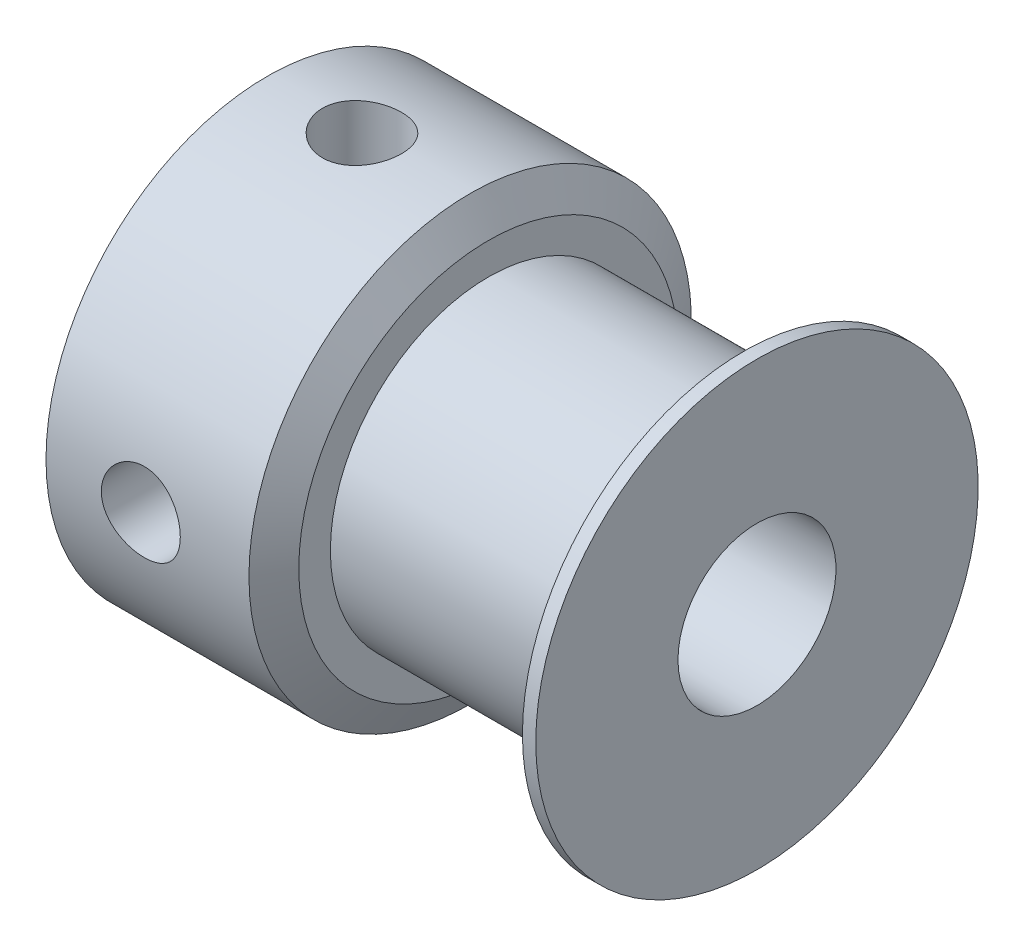
ISO-10303-21;
HEADER;
FILE_DESCRIPTION(('STEP AP214'),'2;1');
FILE_NAME('part.step','',(''),(''),'','','');
FILE_SCHEMA(('AUTOMOTIVE_DESIGN { 1 0 10303 214 1 1 1 1 }'));
ENDSEC;
DATA;
#1=APPLICATION_CONTEXT('core data for automotive mechanical design processes');
#2=APPLICATION_PROTOCOL_DEFINITION('international standard','automotive_design',2000,#1);
#3=PRODUCT_CONTEXT('',#1,'mechanical');
#4=PRODUCT('Part','Part','',(#3));
#5=PRODUCT_RELATED_PRODUCT_CATEGORY('part','',(#4));
#6=PRODUCT_DEFINITION_FORMATION('','',#4);
#7=PRODUCT_DEFINITION_CONTEXT('part definition',#1,'design');
#8=PRODUCT_DEFINITION('design','',#6,#7);
#9=PRODUCT_DEFINITION_SHAPE('','',#8);
#10=(LENGTH_UNIT() NAMED_UNIT(*) SI_UNIT(.MILLI.,.METRE.));
#11=(NAMED_UNIT(*) PLANE_ANGLE_UNIT() SI_UNIT($,.RADIAN.));
#12=(NAMED_UNIT(*) SI_UNIT($,.STERADIAN.) SOLID_ANGLE_UNIT());
#13=UNCERTAINTY_MEASURE_WITH_UNIT(LENGTH_MEASURE(1.E-05),#10,'distance_accuracy_value','');
#14=(GEOMETRIC_REPRESENTATION_CONTEXT(3) GLOBAL_UNCERTAINTY_ASSIGNED_CONTEXT((#13)) GLOBAL_UNIT_ASSIGNED_CONTEXT((#10,
#11,#12)) REPRESENTATION_CONTEXT('',''));
#15=CARTESIAN_POINT('',(0.,0.,0.));
#16=DIRECTION('',(0.,0.,1.));
#17=DIRECTION('',(1.,0.,0.));
#18=AXIS2_PLACEMENT_3D('',#15,#16,#17);
#19=CARTESIAN_POINT('',(0.,0.,0.));
#20=DIRECTION('',(-1.,0.,0.));
#21=DIRECTION('',(0.,0.,1.));
#22=AXIS2_PLACEMENT_3D('',#19,#20,#21);
#23=CYLINDRICAL_SURFACE('',#22,7.);
#24=CARTESIAN_POINT('',(3.,6.88748865697796,-1.24999999999999));
#25=CARTESIAN_POINT('',(3.06960981649712,6.88748996954043,-1.24999727058216));
#26=CARTESIAN_POINT('',(3.13925577090836,6.88855539631359,-1.244165655775));
#27=CARTESIAN_POINT('',(3.27658813268223,6.89269731089963,-1.22100652068063));
#28=CARTESIAN_POINT('',(3.34427275887336,6.89577557035795,-1.20366887286765));
#29=CARTESIAN_POINT('',(3.47567533032676,6.90358364916876,-1.15804345864265));
#30=CARTESIAN_POINT('',(3.53939674386728,6.90831199983703,-1.12976542743178));
#31=CARTESIAN_POINT('',(3.66118554390376,6.91888575789873,-1.06308709156949));
#32=CARTESIAN_POINT('',(3.71925345678452,6.92473106114478,-1.024687730529));
#33=CARTESIAN_POINT('',(3.82874846388985,6.93695388500191,-0.93839416770449));
#34=CARTESIAN_POINT('',(3.88010240853284,6.94333619287745,-0.890407813560986));
#35=CARTESIAN_POINT('',(3.9740752644626,6.95587151277918,-0.786501592761247));
#36=CARTESIAN_POINT('',(4.01669362747573,6.96202451039329,-0.730581228513119));
#37=CARTESIAN_POINT('',(4.09226335513356,6.97345895530131,-0.61191669261587));
#38=CARTESIAN_POINT('',(4.12514613556871,6.97873410967655,-0.54912818591584));
#39=CARTESIAN_POINT('',(4.17986987134275,6.98776505059445,-0.418808386401028));
#40=CARTESIAN_POINT('',(4.20171165013535,6.99152095044113,-0.351277447711591));
#41=CARTESIAN_POINT('',(4.23350824502261,6.99705638797053,-0.214146836822079));
#42=CARTESIAN_POINT('',(4.24358620852175,6.99885638662347,-0.144576558422043));
#43=CARTESIAN_POINT('',(4.25195246362316,7.00034763590468,-0.00471086886383662));
#44=CARTESIAN_POINT('',(4.25024166961667,7.00003905008465,0.0655844856317288));
#45=CARTESIAN_POINT('',(4.23517412290163,6.99736398085761,0.20406149421643));
#46=CARTESIAN_POINT('',(4.22194993820071,6.99502092367386,0.272258090526031));
#47=CARTESIAN_POINT('',(4.1844402560446,6.98856637600324,0.40544850755117));
#48=CARTESIAN_POINT('',(4.16015438386941,6.98445482560808,0.470442219684803));
#49=CARTESIAN_POINT('',(4.10108200704185,6.97488577604636,0.595770759145057));
#50=CARTESIAN_POINT('',(4.06624178895891,6.96942141877376,0.656079724180665));
#51=CARTESIAN_POINT('',(3.98708918053059,6.95775231003517,0.770045070467631));
#52=CARTESIAN_POINT('',(3.94277591348869,6.95154749006553,0.823700835262633));
#53=CARTESIAN_POINT('',(3.8452024440059,6.93898404447278,0.923621204631548));
#54=CARTESIAN_POINT('',(3.79182630608111,6.93262448011293,0.969772549956993));
#55=CARTESIAN_POINT('',(3.67803039591348,6.92055128314469,1.05248393120499));
#56=CARTESIAN_POINT('',(3.61761053864458,6.91483765833521,1.08904385133032));
#57=CARTESIAN_POINT('',(3.49130047605134,6.9047022633392,1.15156239914801));
#58=CARTESIAN_POINT('',(3.42540258587685,6.90028234868337,1.17750582091644));
#59=CARTESIAN_POINT('',(3.29008709379431,6.89326416740436,1.21792201530047));
#60=CARTESIAN_POINT('',(3.22066985173794,6.89066571493896,1.23239595815692));
#61=CARTESIAN_POINT('',(3.08130395227941,6.88762108850772,1.24929958102732));
#62=CARTESIAN_POINT('',(3.01137557652504,6.88714593969675,1.25189141836656));
#63=CARTESIAN_POINT('',(2.87208483149206,6.88832434230049,1.24539080908278));
#64=CARTESIAN_POINT('',(2.802722437094,6.8899777987203,1.23629888388003));
#65=CARTESIAN_POINT('',(2.66705770886579,6.89520021618655,1.2068276293292));
#66=CARTESIAN_POINT('',(2.60073654869653,6.89875493086168,1.18653221333188));
#67=CARTESIAN_POINT('',(2.47243634389799,6.90736720724906,1.1353186675585));
#68=CARTESIAN_POINT('',(2.41045759337242,6.91242487063201,1.1043998191119));
#69=CARTESIAN_POINT('',(2.29188393676615,6.92353975122151,1.03243967511492));
#70=CARTESIAN_POINT('',(2.23535254576533,6.92960692638079,0.991295287980516));
#71=CARTESIAN_POINT('',(2.12993787241714,6.94202871683633,0.900192111722114));
#72=CARTESIAN_POINT('',(2.08105521171645,6.948383355442,0.850232606855256));
#73=CARTESIAN_POINT('',(1.99172584264186,6.96075653395235,0.742195671696033));
#74=CARTESIAN_POINT('',(1.95138779019242,6.96677010600177,0.68402774310814));
#75=CARTESIAN_POINT('',(1.88105696878897,6.97770176369223,0.561646482834216));
#76=CARTESIAN_POINT('',(1.8510638284892,6.98261988865371,0.497433368254334));
#77=CARTESIAN_POINT('',(1.80243974072131,6.99078504784243,0.365094674162076));
#78=CARTESIAN_POINT('',(1.78375389171076,6.99404014454907,0.296989785710919));
#79=CARTESIAN_POINT('',(1.75809885825998,6.99854674650377,0.158545171643455));
#80=CARTESIAN_POINT('',(1.75112856045472,6.9997984421407,0.0882056590377879));
#81=CARTESIAN_POINT('',(1.74913828652657,7.00015390840352,-0.0516665846856979));
#82=CARTESIAN_POINT('',(1.75395367443198,6.99928727056153,-0.121196952146442));
#83=CARTESIAN_POINT('',(1.77503948336937,6.99556445478262,-0.258441278027702));
#84=CARTESIAN_POINT('',(1.79130981581298,6.99270829223196,-0.326155250491352));
#85=CARTESIAN_POINT('',(1.83477696848558,6.98532676084549,-0.457768248748356));
#86=CARTESIAN_POINT('',(1.86195781286409,6.98080383338057,-0.521672696232902));
#87=CARTESIAN_POINT('',(1.92645534655502,6.97058019672508,-0.644038951932202));
#88=CARTESIAN_POINT('',(1.96377262887586,6.96487941863181,-0.702500441450742));
#89=CARTESIAN_POINT('',(2.04805799435721,6.952836532558,-0.81314573886999));
#90=CARTESIAN_POINT('',(2.09514575941667,6.94648702073379,-0.865237582180811));
#91=CARTESIAN_POINT('',(2.19738568597888,6.9339109875311,-0.960837754478946));
#92=CARTESIAN_POINT('',(2.25253973630334,6.92768449534789,-1.0043440674357));
#93=CARTESIAN_POINT('',(2.3698905806021,6.91600352705983,-1.08187311208401));
#94=CARTESIAN_POINT('',(2.43214182635074,6.9105558585827,-1.11581447160549));
#95=CARTESIAN_POINT('',(2.56153753386917,6.90113054241701,-1.17270443470092));
#96=CARTESIAN_POINT('',(2.62867718382994,6.89715147194968,-1.19566368416921));
#97=CARTESIAN_POINT('',(2.74670336760047,6.89196709058452,-1.22512899390276));
#98=CARTESIAN_POINT('',(2.7968879329533,6.89029736637019,-1.23444009540768));
#99=CARTESIAN_POINT('',(2.89804188098638,6.88805768145138,-1.24687652719077));
#100=CARTESIAN_POINT('',(2.94901124564724,6.88748769553417,-1.25000199928145));
#101=CARTESIAN_POINT('',(3.,6.88748865697796,-1.24999999999999));
#102=B_SPLINE_CURVE_WITH_KNOTS('',3,(#24,#25,#26,#27,#28,#29,#30,#31,#32,#33,#34,#35,#36,#37,
#38,#39,#40,#41,#42,#43,#44,#45,#46,#47,#48,#49,#50,#51,#52,#53,#54,#55,#56,#57,#58,#59,#60,#61,
#62,#63,#64,#65,#66,#67,#68,#69,#70,#71,#72,#73,#74,#75,#76,#77,#78,#79,#80,#81,#82,#83,#84,#85,
#86,#87,#88,#89,#90,#91,#92,#93,#94,#95,#96,#97,#98,#99,#100,#101),.UNSPECIFIED.,.T.,.F.,(4,2,2,
2,2,2,2,2,2,2,2,2,2,2,2,2,2,2,2,2,2,2,2,2,2,2,2,2,2,2,2,2,2,2,2,2,2,2,4),(0.,0.208642917991768,
0.417469725950519,0.626111137078801,0.834733103457354,1.04546625757605,1.25621263394898,
1.46841013637387,1.68059181046931,1.89053179249465,2.10045549077495,2.30799357302799,
2.51553868625636,2.72415831217084,2.93279725344391,3.14433992309172,3.35588514657531,
3.56773231290165,3.77955786149433,3.9884838089891,4.19740043290862,4.40477310984189,
4.61215981820873,4.82172878741963,5.0313147804049,5.24342420945204,5.4555260237282,
5.6665895560305,5.87763302917861,6.08574527367395,6.29385590872262,6.50166292039698,
6.70948209195071,6.92001555937826,7.13059840502186,7.34292209858117,7.55503954947577,
7.70787268329129,7.8607023131951),.UNSPECIFIED.);
#103=CARTESIAN_POINT('',(3.,6.88748865697796,-1.24999999999999));
#104=VERTEX_POINT('',#103);
#105=EDGE_CURVE('E119',#104,#104,#102,.T.);
#106=ORIENTED_EDGE('',*,*,#105,.T.);
#107=EDGE_LOOP('',(#106));
#108=FACE_BOUND('',#107,.T.);
#109=CARTESIAN_POINT('',(4.24999999999999,0.,7.));
#110=CARTESIAN_POINT('',(4.24999727869892,-0.0696197924423457,6.99999876397597));
#111=CARTESIAN_POINT('',(4.24416404877482,-0.139275699399383,6.99895060928587));
#112=CARTESIAN_POINT('',(4.22099791680885,-0.276628730775723,6.99487029587919));
#113=CARTESIAN_POINT('',(4.20365492458106,-0.344324082054931,6.99183639636521));
#114=CARTESIAN_POINT('',(4.15801388338098,-0.47574935800167,6.98412437753366));
#115=CARTESIAN_POINT('',(4.12972531781579,-0.539482660117307,6.97944768188137));
#116=CARTESIAN_POINT('',(4.06302215589146,-0.66129147199422,6.96896231649392));
#117=CARTESIAN_POINT('',(4.02460852790026,-0.719367522091873,6.96315375502504));
#118=CARTESIAN_POINT('',(3.93830039349123,-0.828853721624173,6.95097616233974));
#119=CARTESIAN_POINT('',(3.89031693506454,-0.880193210153487,6.94460221026335));
#120=CARTESIAN_POINT('',(3.78642262523124,-0.974138056636678,6.93204924305886));
#121=CARTESIAN_POINT('',(3.73051123631557,-1.01674282190198,6.92587024118302));
#122=CARTESIAN_POINT('',(3.61185494144326,-1.09229802264273,6.91435905121301));
#123=CARTESIAN_POINT('',(3.54906415653801,-1.12517745968519,6.90903321476433));
#124=CARTESIAN_POINT('',(3.41873942066775,-1.17989439084462,6.89990026216799));
#125=CARTESIAN_POINT('',(3.35120583963808,-1.20173274507261,6.89609302772464));
#126=CARTESIAN_POINT('',(3.21406558929257,-1.23352263528583,6.89047765557561));
#127=CARTESIAN_POINT('',(3.1444882224292,-1.24359686781955,6.88864889795947));
#128=CARTESIAN_POINT('',(3.00460853899633,-1.25195320297836,6.88713528511934));
#129=CARTESIAN_POINT('',(2.93430628180395,-1.25023626389774,6.88745025566986));
#130=CARTESIAN_POINT('',(2.79585555128173,-1.23515868236774,6.89016971388499));
#131=CARTESIAN_POINT('',(2.72769140487289,-1.22193680797516,6.8925492980011));
#132=CARTESIAN_POINT('',(2.59456468175073,-1.18444287693054,6.89909080824473));
#133=CARTESIAN_POINT('',(2.52960222965731,-1.16017039053014,6.90325280368823));
#134=CARTESIAN_POINT('',(2.40431276056538,-1.10112633898189,6.9129166031172));
#135=CARTESIAN_POINT('',(2.34401305919556,-1.0662980393802,6.91842561521352));
#136=CARTESIAN_POINT('',(2.23006124889227,-0.987171201031498,6.93015785316705));
#137=CARTESIAN_POINT('',(2.17640975445041,-0.942871787902341,6.93638114494264));
#138=CARTESIAN_POINT('',(2.07647489110634,-0.845308544532932,6.94894965501386));
#139=CARTESIAN_POINT('',(2.03030754101022,-0.791925855758304,6.95529534624387));
#140=CARTESIAN_POINT('',(1.947566933546,-0.678111000701378,6.96731186800251));
#141=CARTESIAN_POINT('',(1.91099375617485,-0.617678775645576,6.97298269290384));
#142=CARTESIAN_POINT('',(1.84846548815187,-0.491364562705142,6.98302041929516));
#143=CARTESIAN_POINT('',(1.82252165885106,-0.425476883346249,6.98738593655032));
#144=CARTESIAN_POINT('',(1.78210155890402,-0.290183700517968,6.99431030998523));
#145=CARTESIAN_POINT('',(1.76762418496357,-0.220778536182408,6.99686933998133));
#146=CARTESIAN_POINT('',(1.75070757697749,-0.0814194926908553,6.9998687531765));
#147=CARTESIAN_POINT('',(1.74810924572599,-0.0114855085287164,7.00033713461244));
#148=CARTESIAN_POINT('',(1.75459886988166,0.127817981130508,6.99917952689596));
#149=CARTESIAN_POINT('',(1.76368630651395,0.197187511548229,6.99755363071634));
#150=CARTESIAN_POINT('',(1.79315719924516,0.332894154940018,6.99240754172808));
#151=CARTESIAN_POINT('',(1.8134609196089,0.399249135096585,6.98890072530253));
#152=CARTESIAN_POINT('',(1.86470231509272,0.527613333347348,6.98038436613849));
#153=CARTESIAN_POINT('',(1.89564065858441,0.589622278004151,6.97537472895227));
#154=CARTESIAN_POINT('',(1.96763061145618,0.708218549757095,6.96433866934137));
#155=CARTESIAN_POINT('',(2.00878039576991,0.764745364265275,6.95830256688857));
#156=CARTESIAN_POINT('',(2.09989132553076,0.870148314945126,6.94590984015708));
#157=CARTESIAN_POINT('',(2.14985321229672,0.919023806795194,6.93955318894436));
#158=CARTESIAN_POINT('',(2.25788748462378,1.00833474628657,6.92714394562996));
#159=CARTESIAN_POINT('',(2.31604985043357,1.04866208560833,6.92109590760897));
#160=CARTESIAN_POINT('',(2.4384168447244,1.11897413538699,6.91007733322136));
#161=CARTESIAN_POINT('',(2.50262126220141,1.14895920685206,6.90510675924693));
#162=CARTESIAN_POINT('',(2.63496308742034,1.19757853098713,6.89684095181923));
#163=CARTESIAN_POINT('',(2.70308110540906,1.21626421462317,6.89353813880083));
#164=CARTESIAN_POINT('',(2.84155364757312,1.24191447945725,6.88896372120458));
#165=CARTESIAN_POINT('',(2.91190794462235,1.24888024712931,6.88769191101738));
#166=CARTESIAN_POINT('',(3.05177460445073,1.25085614890262,6.88733324217078));
#167=CARTESIAN_POINT('',(3.12128453857092,1.24603664017666,6.88821524963872));
#168=CARTESIAN_POINT('',(3.25848690900904,1.22494973121549,6.89199615523606));
#169=CARTESIAN_POINT('',(3.32617935387105,1.20868238480685,6.89489504388228));
#170=CARTESIAN_POINT('',(3.45774493801669,1.16523056932674,6.90237052940212));
#171=CARTESIAN_POINT('',(3.52162377589304,1.13806288257357,6.9069445462846));
#172=CARTESIAN_POINT('',(3.64394421971837,1.07359967028367,6.91725701322019));
#173=CARTESIAN_POINT('',(3.7023854911892,1.03630352227252,6.92299553483587));
#174=CARTESIAN_POINT('',(3.81302852369501,0.952042837143909,6.93508798882304));
#175=CARTESIAN_POINT('',(3.86513461587161,0.904953705777509,6.94144922951403));
#176=CARTESIAN_POINT('',(3.96076290298311,0.802704998630155,6.95401412176594));
#177=CARTESIAN_POINT('',(4.00428312073864,0.747543569019634,6.9602177367425));
#178=CARTESIAN_POINT('',(4.08182888389441,0.630185373301314,6.9718267339403));
#179=CARTESIAN_POINT('',(4.11577512969579,0.567935518835288,6.97722528421424));
#180=CARTESIAN_POINT('',(4.17267460164636,0.438542420095237,6.98654935562556));
#181=CARTESIAN_POINT('',(4.19563843074879,0.371403967978269,6.99047629672906));
#182=CARTESIAN_POINT('',(4.22511530669803,0.253365877745873,6.99558898678742));
#183=CARTESIAN_POINT('',(4.23443156846835,0.203167433835834,6.99723399859316));
#184=CARTESIAN_POINT('',(4.24687484520185,0.10198577601947,6.99943994626216));
#185=CARTESIAN_POINT('',(4.25000199359073,0.0510025790548306,7.00000090549557));
#186=CARTESIAN_POINT('',(4.24999999999999,0.,7.));
#187=B_SPLINE_CURVE_WITH_KNOTS('',3,(#109,#110,#111,#112,#113,#114,#115,#116,#117,#118,#119,
#120,#121,#122,#123,#124,#125,#126,#127,#128,#129,#130,#131,#132,#133,#134,#135,#136,#137,#138,
#139,#140,#141,#142,#143,#144,#145,#146,#147,#148,#149,#150,#151,#152,#153,#154,#155,#156,#157,
#158,#159,#160,#161,#162,#163,#164,#165,#166,#167,#168,#169,#170,#171,#172,#173,#174,#175,#176,
#177,#178,#179,#180,#181,#182,#183,#184,#185,#186),.UNSPECIFIED.,.T.,.F.,(4,2,2,2,2,2,2,2,2,2,2,
2,2,2,2,2,2,2,2,2,2,2,2,2,2,2,2,2,2,2,2,2,2,2,2,2,2,2,4),(0.,0.208672898370814,0.41752897468701,
0.626204498745018,0.834860072169508,1.04555398394513,1.2562621874814,1.46847268234668,
1.680666643261,1.89062713379411,2.10057056058127,2.30801629213299,2.51547009175176,
2.7240592869755,2.93266774767274,3.14425188945736,3.35583779539069,3.56764729168081,
3.7794364053344,3.98838053310805,4.19731538539158,4.40478370072619,4.61226505754753,
4.82182420244063,5.03140098492946,5.24348810388939,5.45556781896714,5.66667480743358,
5.87776042304785,6.08581286176571,6.29386432224864,6.50159668543021,6.7093418183065,
6.91991234386759,7.13053130374624,7.34284672270059,7.55495674626046,7.7078311670234,
7.86070229206405),.UNSPECIFIED.);
#188=CARTESIAN_POINT('',(4.24999999999999,0.,7.));
#189=VERTEX_POINT('',#188);
#190=EDGE_CURVE('E77',#189,#189,#187,.T.);
#191=ORIENTED_EDGE('',*,*,#190,.T.);
#192=EDGE_LOOP('',(#191));
#193=FACE_BOUND('',#192,.T.);
#194=CARTESIAN_POINT('',(0.,0.,0.));
#195=DIRECTION('',(-1.,0.,0.));
#196=DIRECTION('',(0.,0.,1.));
#197=AXIS2_PLACEMENT_3D('',#194,#195,#196);
#198=CIRCLE('',#197,7.);
#199=CARTESIAN_POINT('',(0.,0.,7.));
#200=VERTEX_POINT('',#199);
#201=EDGE_CURVE('E67',#200,#200,#198,.T.);
#202=ORIENTED_EDGE('',*,*,#201,.F.);
#203=EDGE_LOOP('',(#202));
#204=FACE_BOUND('',#203,.T.);
#205=CARTESIAN_POINT('',(6.42264973081037,0.,0.));
#206=DIRECTION('',(-1.,0.,0.));
#207=DIRECTION('',(0.,0.,1.));
#208=AXIS2_PLACEMENT_3D('',#205,#206,#207);
#209=CIRCLE('',#208,7.);
#210=CARTESIAN_POINT('',(6.42264973081037,0.,7.));
#211=VERTEX_POINT('',#210);
#212=EDGE_CURVE('E10',#211,#211,#209,.T.);
#213=ORIENTED_EDGE('',*,*,#212,.T.);
#214=EDGE_LOOP('',(#213));
#215=FACE_BOUND('',#214,.T.);
#216=ADVANCED_FACE('F33',(#108,#193,#204,#215),#23,.T.);
#217=CARTESIAN_POINT('',(7.,0.,0.));
#218=DIRECTION('',(-1.,0.,0.));
#219=DIRECTION('',(0.,0.,1.));
#220=AXIS2_PLACEMENT_3D('',#217,#218,#219);
#221=CONICAL_SURFACE('',#220,6.,1.0471975511966);
#222=ORIENTED_EDGE('',*,*,#212,.F.);
#223=EDGE_LOOP('',(#222));
#224=FACE_BOUND('',#223,.T.);
#225=CARTESIAN_POINT('',(7.,0.,0.));
#226=DIRECTION('',(-1.,0.,0.));
#227=DIRECTION('',(0.,0.,1.));
#228=AXIS2_PLACEMENT_3D('',#225,#226,#227);
#229=CIRCLE('',#228,6.);
#230=CARTESIAN_POINT('',(7.,0.,6.));
#231=VERTEX_POINT('',#230);
#232=EDGE_CURVE('E39',#231,#231,#229,.T.);
#233=ORIENTED_EDGE('',*,*,#232,.T.);
#234=EDGE_LOOP('',(#233));
#235=FACE_BOUND('',#234,.T.);
#236=ADVANCED_FACE('F108',(#224,#235),#221,.T.);
#237=CARTESIAN_POINT('',(7.,6.,0.));
#238=DIRECTION('',(-1.,0.,0.));
#239=DIRECTION('',(0.,0.,1.));
#240=AXIS2_PLACEMENT_3D('',#237,#238,#239);
#241=PLANE('',#240);
#242=ORIENTED_EDGE('',*,*,#232,.F.);
#243=EDGE_LOOP('',(#242));
#244=FACE_BOUND('',#243,.T.);
#245=CARTESIAN_POINT('',(7.,0.,0.));
#246=DIRECTION('',(-1.,0.,0.));
#247=DIRECTION('',(0.,0.,1.));
#248=AXIS2_PLACEMENT_3D('',#245,#246,#247);
#249=CIRCLE('',#248,5.);
#250=CARTESIAN_POINT('',(7.,0.,5.));
#251=VERTEX_POINT('',#250);
#252=EDGE_CURVE('E43',#251,#251,#249,.T.);
#253=ORIENTED_EDGE('',*,*,#252,.T.);
#254=EDGE_LOOP('',(#253));
#255=FACE_BOUND('',#254,.T.);
#256=ADVANCED_FACE('F114',(#244,#255),#241,.F.);
#257=CARTESIAN_POINT('',(0.,0.,0.));
#258=DIRECTION('',(-1.,0.,0.));
#259=DIRECTION('',(0.,0.,1.));
#260=AXIS2_PLACEMENT_3D('',#257,#258,#259);
#261=CYLINDRICAL_SURFACE('',#260,5.);
#262=ORIENTED_EDGE('',*,*,#252,.F.);
#263=EDGE_LOOP('',(#262));
#264=FACE_BOUND('',#263,.T.);
#265=CARTESIAN_POINT('',(14.5,0.,0.));
#266=DIRECTION('',(-1.,0.,0.));
#267=DIRECTION('',(0.,0.,1.));
#268=AXIS2_PLACEMENT_3D('',#265,#266,#267);
#269=CIRCLE('',#268,5.);
#270=CARTESIAN_POINT('',(14.5,0.,5.));
#271=VERTEX_POINT('',#270);
#272=EDGE_CURVE('E47',#271,#271,#269,.T.);
#273=ORIENTED_EDGE('',*,*,#272,.T.);
#274=EDGE_LOOP('',(#273));
#275=FACE_BOUND('',#274,.T.);
#276=ADVANCED_FACE('F188',(#264,#275),#261,.T.);
#277=CARTESIAN_POINT('',(14.5,5.,0.));
#278=DIRECTION('',(1.,0.,0.));
#279=DIRECTION('',(0.,0.,-1.));
#280=AXIS2_PLACEMENT_3D('',#277,#278,#279);
#281=PLANE('',#280);
#282=ORIENTED_EDGE('',*,*,#272,.F.);
#283=EDGE_LOOP('',(#282));
#284=FACE_BOUND('',#283,.T.);
#285=CARTESIAN_POINT('',(14.5,0.,0.));
#286=DIRECTION('',(-1.,0.,0.));
#287=DIRECTION('',(0.,0.,1.));
#288=AXIS2_PLACEMENT_3D('',#285,#286,#287);
#289=CIRCLE('',#288,6.);
#290=CARTESIAN_POINT('',(14.5,0.,6.));
#291=VERTEX_POINT('',#290);
#292=EDGE_CURVE('E52',#291,#291,#289,.T.);
#293=ORIENTED_EDGE('',*,*,#292,.T.);
#294=EDGE_LOOP('',(#293));
#295=FACE_BOUND('',#294,.T.);
#296=ADVANCED_FACE('F178',(#284,#295),#281,.F.);
#297=CARTESIAN_POINT('',(15.0773502691896,0.,0.));
#298=DIRECTION('',(1.,0.,0.));
#299=DIRECTION('',(0.,0.,-1.));
#300=AXIS2_PLACEMENT_3D('',#297,#298,#299);
#301=CONICAL_SURFACE('',#300,6.99999999999999,1.04719755119659);
#302=ORIENTED_EDGE('',*,*,#292,.F.);
#303=EDGE_LOOP('',(#302));
#304=FACE_BOUND('',#303,.T.);
#305=CARTESIAN_POINT('',(15.0773502691896,0.,0.));
#306=DIRECTION('',(-1.,0.,0.));
#307=DIRECTION('',(0.,0.,1.));
#308=AXIS2_PLACEMENT_3D('',#305,#306,#307);
#309=CIRCLE('',#308,6.99999999999999);
#310=CARTESIAN_POINT('',(15.0773502691896,0.,6.99999999999999));
#311=VERTEX_POINT('',#310);
#312=EDGE_CURVE('E55',#311,#311,#309,.T.);
#313=ORIENTED_EDGE('',*,*,#312,.T.);
#314=EDGE_LOOP('',(#313));
#315=FACE_BOUND('',#314,.T.);
#316=ADVANCED_FACE('F168',(#304,#315),#301,.T.);
#317=CARTESIAN_POINT('',(0.,0.,0.));
#318=DIRECTION('',(-1.,0.,0.));
#319=DIRECTION('',(0.,0.,1.));
#320=AXIS2_PLACEMENT_3D('',#317,#318,#319);
#321=CYLINDRICAL_SURFACE('',#320,6.99999999999999);
#322=ORIENTED_EDGE('',*,*,#312,.F.);
#323=EDGE_LOOP('',(#322));
#324=FACE_BOUND('',#323,.T.);
#325=CARTESIAN_POINT('',(15.5,0.,0.));
#326=DIRECTION('',(-1.,0.,0.));
#327=DIRECTION('',(0.,0.,1.));
#328=AXIS2_PLACEMENT_3D('',#325,#326,#327);
#329=CIRCLE('',#328,7.);
#330=CARTESIAN_POINT('',(15.5,0.,7.));
#331=VERTEX_POINT('',#330);
#332=EDGE_CURVE('E58',#331,#331,#329,.T.);
#333=ORIENTED_EDGE('',*,*,#332,.T.);
#334=EDGE_LOOP('',(#333));
#335=FACE_BOUND('',#334,.T.);
#336=ADVANCED_FACE('F159',(#324,#335),#321,.T.);
#337=CARTESIAN_POINT('',(15.5,7.,0.));
#338=DIRECTION('',(-1.,0.,0.));
#339=DIRECTION('',(0.,0.,1.));
#340=AXIS2_PLACEMENT_3D('',#337,#338,#339);
#341=PLANE('',#340);
#342=ORIENTED_EDGE('',*,*,#332,.F.);
#343=EDGE_LOOP('',(#342));
#344=FACE_BOUND('',#343,.T.);
#345=CARTESIAN_POINT('',(15.5,0.,0.));
#346=DIRECTION('',(-1.,0.,0.));
#347=DIRECTION('',(0.,0.,1.));
#348=AXIS2_PLACEMENT_3D('',#345,#346,#347);
#349=CIRCLE('',#348,2.5);
#350=CARTESIAN_POINT('',(15.5,0.,2.5));
#351=VERTEX_POINT('',#350);
#352=EDGE_CURVE('E61',#351,#351,#349,.T.);
#353=ORIENTED_EDGE('',*,*,#352,.T.);
#354=EDGE_LOOP('',(#353));
#355=FACE_BOUND('',#354,.T.);
#356=ADVANCED_FACE('F103',(#344,#355),#341,.F.);
#357=CARTESIAN_POINT('',(0.,0.,0.));
#358=DIRECTION('',(-1.,0.,0.));
#359=DIRECTION('',(0.,0.,1.));
#360=AXIS2_PLACEMENT_3D('',#357,#358,#359);
#361=CYLINDRICAL_SURFACE('',#360,2.5);
#362=CARTESIAN_POINT('',(3.,2.1650635094611,-1.24999999999999));
#363=CARTESIAN_POINT('',(2.93486523975594,2.16506918410574,-1.24999545384316));
#364=CARTESIAN_POINT('',(2.86964823559369,2.16804751484696,-1.24487496341651));
#365=CARTESIAN_POINT('',(2.74121591915356,2.17952958065066,-1.22465401237256));
#366=CARTESIAN_POINT('',(2.67800510619574,2.1880449256945,-1.20953258069272));
#367=CARTESIAN_POINT('',(2.55568541957008,2.20936683256748,-1.17012493587476));
#368=CARTESIAN_POINT('',(2.49655668440802,2.22215054341565,-1.14588744061716));
#369=CARTESIAN_POINT('',(2.3832197475041,2.25053331021073,-1.08908440672046));
#370=CARTESIAN_POINT('',(2.32901181217193,2.26613251845081,-1.05651841754471));
#371=CARTESIAN_POINT('',(2.22211783930312,2.29996086321802,-0.980833175663592));
#372=CARTESIAN_POINT('',(2.16992608040807,2.31830079547442,-0.937065045179707));
#373=CARTESIAN_POINT('',(2.07323951449162,2.35464978482132,-0.841567259518079));
#374=CARTESIAN_POINT('',(2.0287485467706,2.37265867289063,-0.789833657227861));
#375=CARTESIAN_POINT('',(1.94579106106543,2.40776846191186,-0.675611954268178));
#376=CARTESIAN_POINT('',(1.90793279017559,2.42472633022716,-0.612633986265714));
#377=CARTESIAN_POINT('',(1.8435739334428,2.45438445124411,-0.480196283249376));
#378=CARTESIAN_POINT('',(1.81706617982854,2.46708738979677,-0.410740672672691));
#379=CARTESIAN_POINT('',(1.77811917337364,2.48600576555297,-0.272556179907469));
#380=CARTESIAN_POINT('',(1.76481309205559,2.49261850276115,-0.20412723811102));
#381=CARTESIAN_POINT('',(1.74979235165621,2.50009479807584,-0.065713285872309));
#382=CARTESIAN_POINT('',(1.74807067900537,2.50096183480737,0.00427075730467384));
#383=CARTESIAN_POINT('',(1.75593334246294,2.49703727395563,0.137290655529687));
#384=CARTESIAN_POINT('',(1.76454751940154,2.492731198652,0.200401498970989));
#385=CARTESIAN_POINT('',(1.79110105488083,2.47967806574684,0.324142214897902));
#386=CARTESIAN_POINT('',(1.80904111122029,2.47093067582992,0.384771901367406));
#387=CARTESIAN_POINT('',(1.85385320761227,2.44964479109568,0.50288673946194));
#388=CARTESIAN_POINT('',(1.88084539146509,2.43705551911499,0.560316779393971));
#389=CARTESIAN_POINT('',(1.94282927025187,2.40922057483359,0.669971001891658));
#390=CARTESIAN_POINT('',(1.97782382912794,2.39397395196855,0.722193311048304));
#391=CARTESIAN_POINT('',(2.05861918941628,2.36055492999037,0.82521707612274));
#392=CARTESIAN_POINT('',(2.10512878540752,2.34224219997719,0.875417593786697));
#393=CARTESIAN_POINT('',(2.20573715616273,2.30567925733515,0.967630462872221));
#394=CARTESIAN_POINT('',(2.25984171534258,2.28742910332036,1.00963651446778));
#395=CARTESIAN_POINT('',(2.37831024053011,2.25180195115606,1.08688166830276));
#396=CARTESIAN_POINT('',(2.44310752881777,2.23455399988385,1.12152164372256));
#397=CARTESIAN_POINT('',(2.57867208919875,2.2046931284822,1.17914889125153));
#398=CARTESIAN_POINT('',(2.64943304127196,2.19207537557585,1.20214832276361));
#399=CARTESIAN_POINT('',(2.78901813910349,2.17430794771293,1.23397526378129));
#400=CARTESIAN_POINT('',(2.85755139880444,2.16864569810621,1.24378140264996));
#401=CARTESIAN_POINT('',(2.99550167689568,2.16397399202012,1.25189618326428));
#402=CARTESIAN_POINT('',(3.06491803639974,2.1649598361164,1.25021294664377));
#403=CARTESIAN_POINT('',(3.19456739822341,2.17292920675731,1.23629505417995));
#404=CARTESIAN_POINT('',(3.25497431388491,2.17924484383318,1.22523477089058));
#405=CARTESIAN_POINT('',(3.3729597328387,2.19617526939177,1.19462035579054));
#406=CARTESIAN_POINT('',(3.43053731343326,2.20679145006293,1.17506347327951));
#407=CARTESIAN_POINT('',(3.54426416362837,2.23170277599571,1.1270594857561));
#408=CARTESIAN_POINT('',(3.60022377106694,2.24614554053829,1.0982425796159));
#409=CARTESIAN_POINT('',(3.70683658942374,2.27695149371562,1.03285883001975));
#410=CARTESIAN_POINT('',(3.7574870543916,2.29331566693935,0.996288005415263));
#411=CARTESIAN_POINT('',(3.85872345940443,2.3285999807042,0.91104645899856));
#412=CARTESIAN_POINT('',(3.90849643839707,2.34758228942862,0.861431590393701));
#413=CARTESIAN_POINT('',(3.99926529749199,2.38417793722366,0.754255619247854));
#414=CARTESIAN_POINT('',(4.04025821278817,2.40179081259637,0.696691843319176));
#415=CARTESIAN_POINT('',(4.11321715743762,2.43426702113696,0.57316920319844));
#416=CARTESIAN_POINT('',(4.14491639776363,2.44904552090037,0.507028871967635));
#417=CARTESIAN_POINT('',(4.19642237982174,2.47354193699126,0.369402955801347));
#418=CARTESIAN_POINT('',(4.21623956420787,2.48326429595466,0.297922126740215));
#419=CARTESIAN_POINT('',(4.24171070521832,2.49584385227353,0.158724602913017));
#420=CARTESIAN_POINT('',(4.24849734484514,2.49924909885239,0.0912643048130675));
#421=CARTESIAN_POINT('',(4.25105408181799,2.50052662968914,-0.0439074824390073));
#422=CARTESIAN_POINT('',(4.24682803565445,2.49840085083612,-0.111618875368861));
#423=CARTESIAN_POINT('',(4.22822949150546,2.48917461047403,-0.240672490396435));
#424=CARTESIAN_POINT('',(4.2145439384279,2.48241118334987,-0.302140397264081));
#425=CARTESIAN_POINT('',(4.17834125087128,2.46490117079279,-0.421807440229522));
#426=CARTESIAN_POINT('',(4.15582284988318,2.45415401415995,-0.480006106194386));
#427=CARTESIAN_POINT('',(4.10159118479253,2.4290741343515,-0.594279257806105));
#428=CARTESIAN_POINT('',(4.06952584599019,2.41460771498499,-0.650156428375057));
#429=CARTESIAN_POINT('',(3.99755258642618,2.38360166427283,-0.755968302267529));
#430=CARTESIAN_POINT('',(3.9576410636054,2.36706108197951,-0.805900259268632));
#431=CARTESIAN_POINT('',(3.86650357622161,2.33160762783285,-0.903642505196112));
#432=CARTESIAN_POINT('',(3.8145468906535,2.31262248764622,-0.950747105674087));
#433=CARTESIAN_POINT('',(3.70318659858778,2.27578845203566,-1.03582910924334));
#434=CARTESIAN_POINT('',(3.64377647391539,2.25794057202332,-1.07379843751257));
#435=CARTESIAN_POINT('',(3.5167041917738,2.22499506631145,-1.14053884973206));
#436=CARTESIAN_POINT('',(3.44884058608907,2.21000217820338,-1.16898133245117));
#437=CARTESIAN_POINT('',(3.30833449457527,2.1858269541044,-1.21359838688301));
#438=CARTESIAN_POINT('',(3.23570888885914,2.17662520184628,-1.22981398896918));
#439=CARTESIAN_POINT('',(3.135243305435,2.16911590752238,-1.24295875983051));
#440=CARTESIAN_POINT('',(3.10829013200264,2.1676016125644,-1.24559513120481));
#441=CARTESIAN_POINT('',(3.0542293991472,2.16557419859688,-1.24911675636245));
#442=CARTESIAN_POINT('',(3.02712182951766,2.16506114656387,-1.25000189299983));
#443=CARTESIAN_POINT('',(3.,2.1650635094611,-1.24999999999999));
#444=B_SPLINE_CURVE_WITH_KNOTS('',3,(#362,#363,#364,#365,#366,#367,#368,#369,#370,#371,#372,
#373,#374,#375,#376,#377,#378,#379,#380,#381,#382,#383,#384,#385,#386,#387,#388,#389,#390,#391,
#392,#393,#394,#395,#396,#397,#398,#399,#400,#401,#402,#403,#404,#405,#406,#407,#408,#409,#410,
#411,#412,#413,#414,#415,#416,#417,#418,#419,#420,#421,#422,#423,#424,#425,#426,#427,#428,#429,
#430,#431,#432,#433,#434,#435,#436,#437,#438,#439,#440,#441,#442,#443),.UNSPECIFIED.,.T.,.F.,(4,
2,2,2,2,2,2,2,2,2,2,2,2,2,2,2,2,2,2,2,2,2,2,2,2,2,2,2,2,2,2,2,2,2,2,2,2,2,2,2,4),(0.,
0.195290153243393,0.390991116031004,0.585660744898605,0.780340906806434,0.991077890622788,
1.20191963855463,1.42697365298454,1.65188533704863,1.86079356209918,2.06957529607549,
2.26020121855672,2.45084140646818,2.64411918413932,2.83746624187838,3.04908989321112,
3.26087560307397,3.48611052161809,3.71110967764629,3.91827863567763,4.12530116485464,
4.30967729280029,4.49411315545076,4.68709120507607,4.88016857775057,5.09758429475764,
5.3150733122275,5.53830226766204,5.76133474760961,5.96390337986855,6.16640108492461,
6.35555531089362,6.54473666890013,6.74200938399336,6.93937287625895,7.1563780231258,
7.37357428556439,7.59763436298252,7.82093916253446,7.90225168981632,7.98356965618171),.UNSPECIFIED.);
#445=CARTESIAN_POINT('',(3.,2.1650635094611,-1.24999999999999));
#446=VERTEX_POINT('',#445);
#447=EDGE_CURVE('E124',#446,#446,#444,.T.);
#448=ORIENTED_EDGE('',*,*,#447,.T.);
#449=EDGE_LOOP('',(#448));
#450=FACE_BOUND('',#449,.T.);
#451=CARTESIAN_POINT('',(4.24999999999999,0.,2.5));
#452=CARTESIAN_POINT('',(4.24999587210062,0.0657149536912327,2.49999641755189));
#453=CARTESIAN_POINT('',(4.2447874085979,0.13150824962254,2.49738113774397));
#454=CARTESIAN_POINT('',(4.22418389957385,0.26115029408553,2.48717695046745));
#455=CARTESIAN_POINT('',(4.20876950875293,0.324995108391878,2.47957859786229));
#456=CARTESIAN_POINT('',(4.168507739229,0.448666931100716,2.4602034925414));
#457=CARTESIAN_POINT('',(4.14369701968998,0.508508503673973,2.448442989719));
#458=CARTESIAN_POINT('',(4.08553672329382,0.623090771008203,2.42182220644723));
#459=CARTESIAN_POINT('',(4.05218781968893,0.677831867487559,2.40696217041913));
#460=CARTESIAN_POINT('',(3.97560343814337,0.784384772202395,2.37445322822571));
#461=CARTESIAN_POINT('',(3.93189190095044,0.835819013902636,2.3566899890942));
#462=CARTESIAN_POINT('',(3.8368481509412,0.930974306083717,2.32074962808431));
#463=CARTESIAN_POINT('',(3.78551018528444,0.974689478883453,2.30257220261294));
#464=CARTESIAN_POINT('',(3.67189581309577,1.05656500056284,2.26623688996684));
#465=CARTESIAN_POINT('',(3.60907987706761,1.09403166943954,2.24818983712665));
#466=CARTESIAN_POINT('',(3.47704083001723,1.15771028361336,2.21607473465401));
#467=CARTESIAN_POINT('',(3.40782233909656,1.18393026870791,2.20200384508737));
#468=CARTESIAN_POINT('',(3.26916861822259,1.22266555273573,2.18072333797261));
#469=CARTESIAN_POINT('',(3.19999443491576,1.23590732135054,2.17315339479642));
#470=CARTESIAN_POINT('',(3.06002645277565,1.25053374163605,2.1647736243566));
#471=CARTESIAN_POINT('',(2.98923432391106,1.25193011046634,2.16395711679111));
#472=CARTESIAN_POINT('',(2.85714246960579,1.24335910896536,2.16888662821561));
#473=CARTESIAN_POINT('',(2.79571996097119,1.23473069942102,2.17385954577517));
#474=CARTESIAN_POINT('',(2.6753476132837,1.20867481132116,2.18845285917313));
#475=CARTESIAN_POINT('',(2.61639856836836,1.19124452987206,2.19807473539721));
#476=CARTESIAN_POINT('',(2.50096358429293,1.1477622254825,2.22109345515927));
#477=CARTESIAN_POINT('',(2.44456700151777,1.12151883389499,2.23457300829999));
#478=CARTESIAN_POINT('',(2.33670713426249,1.061302109585,2.26379255351755));
#479=CARTESIAN_POINT('',(2.28524608049989,1.02732530476558,2.27953355975239));
#480=CARTESIAN_POINT('',(2.18184843407097,0.947582568640979,2.31391447379107));
#481=CARTESIAN_POINT('',(2.13067890802981,0.900868072961596,2.33266887795933));
#482=CARTESIAN_POINT('',(2.03658072676138,0.799444473426711,2.36934529125509));
#483=CARTESIAN_POINT('',(1.99365600995765,0.744731570717851,2.38726689948501));
#484=CARTESIAN_POINT('',(1.91539292371285,0.625645632289806,2.42127484103705));
#485=CARTESIAN_POINT('',(1.88049940944283,0.560941989499256,2.43723730202509));
#486=CARTESIAN_POINT('',(1.82237871369624,0.425582769360993,2.46447351401553));
#487=CARTESIAN_POINT('',(1.79914226873105,0.354931970331593,2.47575098679441));
#488=CARTESIAN_POINT('',(1.76690574535416,0.215958114575875,2.49155417176795));
#489=CARTESIAN_POINT('',(1.75688595531653,0.147926913185403,2.4965617287664));
#490=CARTESIAN_POINT('',(1.74816908608189,0.0109744999366908,2.50091266823877));
#491=CARTESIAN_POINT('',(1.74946664295066,-0.0579462748373776,2.5002587340164));
#492=CARTESIAN_POINT('',(1.76275836052345,-0.189041214982492,2.49363990316801));
#493=CARTESIAN_POINT('',(1.77391566591255,-0.251324260062442,2.48809057110237));
#494=CARTESIAN_POINT('',(1.80529758986886,-0.373008615377395,2.47277714143524));
#495=CARTESIAN_POINT('',(1.82552320806671,-0.432409607113745,2.46301257917916));
#496=CARTESIAN_POINT('',(1.87499808304147,-0.54861076056208,2.43980314267087));
#497=CARTESIAN_POINT('',(1.90448881264602,-0.60528799625769,2.42626102212424));
#498=CARTESIAN_POINT('',(1.97138441955756,-0.713076702123649,2.39679967896386));
#499=CARTESIAN_POINT('',(2.0087926682418,-0.7641857872191,2.38087944457232));
#500=CARTESIAN_POINT('',(2.0947005316661,-0.864709611613313,2.34635276671831));
#501=CARTESIAN_POINT('',(2.14392858556696,-0.913465097280795,2.32763606060552));
#502=CARTESIAN_POINT('',(2.24990643908664,-1.00232040139154,2.29077989504843));
#503=CARTESIAN_POINT('',(2.30666139852047,-1.04241423211355,2.27264084226908));
#504=CARTESIAN_POINT('',(2.42955456775039,-1.11463489312211,2.23813990282585));
#505=CARTESIAN_POINT('',(2.49601408276075,-1.14628186984829,2.2219066207934));
#506=CARTESIAN_POINT('',(2.63438758461566,-1.19760353251725,2.19467590460158));
#507=CARTESIAN_POINT('',(2.70629440812649,-1.21729364485946,2.18367172800773));
#508=CARTESIAN_POINT('',(2.84613777857681,-1.24232710931209,2.16951876260834));
#509=CARTESIAN_POINT('',(2.9137928167863,-1.24886624550107,2.16571729325614));
#510=CARTESIAN_POINT('',(3.04930883396341,-1.25086144297598,2.16456693307719));
#511=CARTESIAN_POINT('',(3.11716971092429,-1.24632230828049,2.16721524534441));
#512=CARTESIAN_POINT('',(3.24435437691502,-1.22740765699032,2.17797327562531));
#513=CARTESIAN_POINT('',(3.3038755876805,-1.21401039292849,2.18553868102992));
#514=CARTESIAN_POINT('',(3.41976014928088,-1.1789691977808,2.20463770234897));
#515=CARTESIAN_POINT('',(3.47612247761496,-1.15732261394975,2.21617259462095));
#516=CARTESIAN_POINT('',(3.58828106373326,-1.10476968162585,2.2428566295566));
#517=CARTESIAN_POINT('',(3.64378487728712,-1.07333892227056,2.25819652995239));
#518=CARTESIAN_POINT('',(3.74909317022573,-1.00268871454579,2.29044164543238));
#519=CARTESIAN_POINT('',(3.79889466314811,-0.963465214048303,2.30734767243153));
#520=CARTESIAN_POINT('',(3.89767747794702,-0.872754158330794,2.34327903949141));
#521=CARTESIAN_POINT('',(3.9458238779524,-0.820355528762707,2.36231229139336));
#522=CARTESIAN_POINT('',(4.03282872927954,-0.707693507775342,2.3984719031886));
#523=CARTESIAN_POINT('',(4.07168217428286,-0.647425904070974,2.4155972326005));
#524=CARTESIAN_POINT('',(4.13904545345275,-0.519914496024927,2.44622511981379));
#525=CARTESIAN_POINT('',(4.16748021176429,-0.452624379918262,2.45970120703636));
#526=CARTESIAN_POINT('',(4.21226020989868,-0.313427626617734,2.48126676704332));
#527=CARTESIAN_POINT('',(4.22863980853697,-0.241534749528953,2.48937154216165));
#528=CARTESIAN_POINT('',(4.24237176384481,-0.140752433104226,2.49619327387079));
#529=CARTESIAN_POINT('',(4.24522830107952,-0.11270234929937,2.49761706674002));
#530=CARTESIAN_POINT('',(4.249043331896,-0.0564396647589456,2.49952121222331));
#531=CARTESIAN_POINT('',(4.25000177308899,-0.028227059559226,2.50000153879704));
#532=CARTESIAN_POINT('',(4.24999999999999,0.,2.5));
#533=B_SPLINE_CURVE_WITH_KNOTS('',3,(#451,#452,#453,#454,#455,#456,#457,#458,#459,#460,#461,
#462,#463,#464,#465,#466,#467,#468,#469,#470,#471,#472,#473,#474,#475,#476,#477,#478,#479,#480,
#481,#482,#483,#484,#485,#486,#487,#488,#489,#490,#491,#492,#493,#494,#495,#496,#497,#498,#499,
#500,#501,#502,#503,#504,#505,#506,#507,#508,#509,#510,#511,#512,#513,#514,#515,#516,#517,#518,
#519,#520,#521,#522,#523,#524,#525,#526,#527,#528,#529,#530,#531,#532),.UNSPECIFIED.,.T.,.F.,(4,
2,2,2,2,2,2,2,2,2,2,2,2,2,2,2,2,2,2,2,2,2,2,2,2,2,2,2,2,2,2,2,2,2,2,2,2,2,2,2,4),(0.,
0.197030321775365,0.394435187136495,0.591077694365371,0.787704700726956,0.996227198397606,
1.20490779706754,1.4297715803844,1.6544743487285,1.86572515175286,2.07676696661274,
2.26257140511649,2.44843504907097,2.63862800210608,2.82890651575276,3.04331176667347,
3.25781918248356,3.48228777768049,3.70657771140347,3.9122911308918,4.11790705639343,
4.3075863313265,4.49728652038662,4.69241070034871,4.88761813435421,5.10199513305521,
5.31651985769287,5.54143352699589,5.76605639925969,5.96911634372963,6.17208824825003,
6.35572412805225,6.53941910979594,6.73545570969514,6.93159451423693,7.15156553440619,
7.37165479220712,7.59330017078652,7.81431135781158,7.89894100172117,7.98357298143554),.UNSPECIFIED.);
#534=CARTESIAN_POINT('',(4.24999999999999,0.,2.5));
#535=VERTEX_POINT('',#534);
#536=EDGE_CURVE('E70',#535,#535,#533,.T.);
#537=ORIENTED_EDGE('',*,*,#536,.T.);
#538=EDGE_LOOP('',(#537));
#539=FACE_BOUND('',#538,.T.);
#540=ORIENTED_EDGE('',*,*,#352,.F.);
#541=EDGE_LOOP('',(#540));
#542=FACE_BOUND('',#541,.T.);
#543=CARTESIAN_POINT('',(0.,0.,0.));
#544=DIRECTION('',(-1.,0.,0.));
#545=DIRECTION('',(0.,0.,1.));
#546=AXIS2_PLACEMENT_3D('',#543,#544,#545);
#547=CIRCLE('',#546,2.5);
#548=CARTESIAN_POINT('',(0.,0.,2.5));
#549=VERTEX_POINT('',#548);
#550=EDGE_CURVE('E64',#549,#549,#547,.T.);
#551=ORIENTED_EDGE('',*,*,#550,.T.);
#552=EDGE_LOOP('',(#551));
#553=FACE_BOUND('',#552,.T.);
#554=ADVANCED_FACE('F82',(#450,#539,#542,#553),#361,.F.);
#555=CARTESIAN_POINT('',(0.,2.5,0.));
#556=DIRECTION('',(1.,0.,0.));
#557=DIRECTION('',(0.,0.,-1.));
#558=AXIS2_PLACEMENT_3D('',#555,#556,#557);
#559=PLANE('',#558);
#560=ORIENTED_EDGE('',*,*,#550,.F.);
#561=EDGE_LOOP('',(#560));
#562=FACE_BOUND('',#561,.T.);
#563=ORIENTED_EDGE('',*,*,#201,.T.);
#564=EDGE_LOOP('',(#563));
#565=FACE_BOUND('',#564,.T.);
#566=ADVANCED_FACE('F91',(#562,#565),#559,.F.);
#567=CARTESIAN_POINT('',(3.,0.,0.));
#568=DIRECTION('',(0.,0.,-1.));
#569=DIRECTION('',(-1.,0.,0.));
#570=AXIS2_PLACEMENT_3D('',#567,#568,#569);
#571=CYLINDRICAL_SURFACE('',#570,1.24999999999999);
#572=ORIENTED_EDGE('',*,*,#190,.F.);
#573=EDGE_LOOP('',(#572));
#574=FACE_BOUND('',#573,.T.);
#575=ORIENTED_EDGE('',*,*,#536,.F.);
#576=EDGE_LOOP('',(#575));
#577=FACE_BOUND('',#576,.T.);
#578=ADVANCED_FACE('F86',(#574,#577),#571,.F.);
#579=CARTESIAN_POINT('',(3.,0.,0.));
#580=DIRECTION('',(0.,-1.,0.));
#581=DIRECTION('',(0.,0.,-1.));
#582=AXIS2_PLACEMENT_3D('',#579,#580,#581);
#583=CYLINDRICAL_SURFACE('',#582,1.24999999999999);
#584=ORIENTED_EDGE('',*,*,#105,.F.);
#585=EDGE_LOOP('',(#584));
#586=FACE_BOUND('',#585,.T.);
#587=ORIENTED_EDGE('',*,*,#447,.F.);
#588=EDGE_LOOP('',(#587));
#589=FACE_BOUND('',#588,.T.);
#590=ADVANCED_FACE('F90',(#586,#589),#583,.F.);
#591=CLOSED_SHELL('',(#216,#236,#256,#276,#296,#316,#336,#356,#554,#566,#578,#590));
#592=MANIFOLD_SOLID_BREP('B2',#591);
#593=ADVANCED_BREP_SHAPE_REPRESENTATION('',(#18,#592),#14);
#594=SHAPE_DEFINITION_REPRESENTATION(#9,#593);
ENDSEC;
END-ISO-10303-21;
